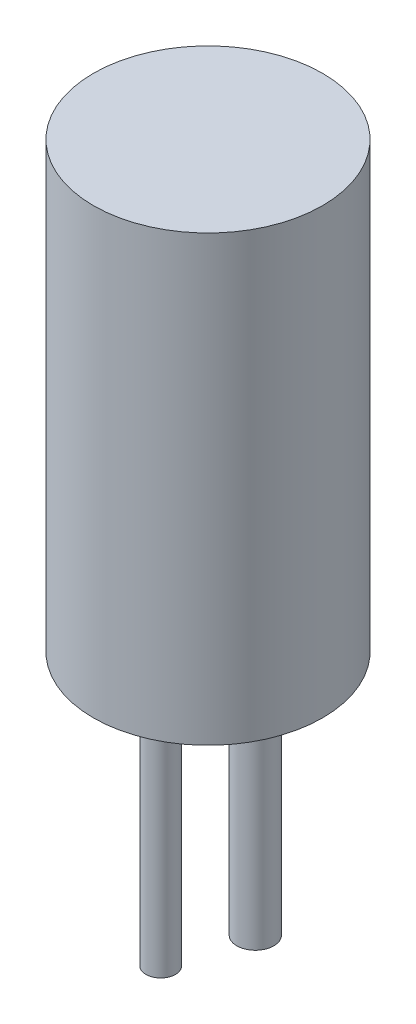
ISO-10303-21;
HEADER;
FILE_DESCRIPTION(('STEP AP214'),'2;1');
FILE_NAME('part.step','',(''),(''),'','','');
FILE_SCHEMA(('AUTOMOTIVE_DESIGN { 1 0 10303 214 1 1 1 1 }'));
ENDSEC;
DATA;
#1=APPLICATION_CONTEXT('core data for automotive mechanical design processes');
#2=APPLICATION_PROTOCOL_DEFINITION('international standard','automotive_design',2000,#1);
#3=PRODUCT_CONTEXT('',#1,'mechanical');
#4=PRODUCT('Part','Part','',(#3));
#5=PRODUCT_RELATED_PRODUCT_CATEGORY('part','',(#4));
#6=PRODUCT_DEFINITION_FORMATION('','',#4);
#7=PRODUCT_DEFINITION_CONTEXT('part definition',#1,'design');
#8=PRODUCT_DEFINITION('design','',#6,#7);
#9=PRODUCT_DEFINITION_SHAPE('','',#8);
#10=(LENGTH_UNIT() NAMED_UNIT(*) SI_UNIT(.MILLI.,.METRE.));
#11=(NAMED_UNIT(*) PLANE_ANGLE_UNIT() SI_UNIT($,.RADIAN.));
#12=(NAMED_UNIT(*) SI_UNIT($,.STERADIAN.) SOLID_ANGLE_UNIT());
#13=UNCERTAINTY_MEASURE_WITH_UNIT(LENGTH_MEASURE(1.E-05),#10,'distance_accuracy_value','');
#14=(GEOMETRIC_REPRESENTATION_CONTEXT(3) GLOBAL_UNCERTAINTY_ASSIGNED_CONTEXT((#13)) GLOBAL_UNIT_ASSIGNED_CONTEXT((#10,
#11,#12)) REPRESENTATION_CONTEXT('',''));
#15=CARTESIAN_POINT('',(0.,0.,0.));
#16=DIRECTION('',(0.,0.,1.));
#17=DIRECTION('',(1.,0.,0.));
#18=AXIS2_PLACEMENT_3D('',#15,#16,#17);
#19=CARTESIAN_POINT('',(0.,0.,0.));
#20=DIRECTION('',(0.,1.,0.));
#21=DIRECTION('',(0.,0.,1.));
#22=AXIS2_PLACEMENT_3D('',#19,#20,#21);
#23=PLANE('',#22);
#24=CARTESIAN_POINT('',(-1.28,0.,0.));
#25=DIRECTION('',(0.,1.,0.));
#26=DIRECTION('',(0.,0.,1.));
#27=AXIS2_PLACEMENT_3D('',#24,#25,#26);
#28=CIRCLE('',#27,0.4);
#29=CARTESIAN_POINT('',(-1.28,0.,0.4));
#30=VERTEX_POINT('',#29);
#31=EDGE_CURVE('E38',#30,#30,#28,.F.);
#32=ORIENTED_EDGE('',*,*,#31,.F.);
#33=EDGE_LOOP('',(#32));
#34=FACE_BOUND('',#33,.T.);
#35=CARTESIAN_POINT('',(0.,0.,0.));
#36=DIRECTION('',(0.,1.,0.));
#37=DIRECTION('',(0.,0.,1.));
#38=AXIS2_PLACEMENT_3D('',#35,#36,#37);
#39=CIRCLE('',#38,3.1);
#40=CARTESIAN_POINT('',(0.,0.,3.1));
#41=VERTEX_POINT('',#40);
#42=EDGE_CURVE('E46',#41,#41,#39,.T.);
#43=ORIENTED_EDGE('',*,*,#42,.F.);
#44=EDGE_LOOP('',(#43));
#45=FACE_BOUND('',#44,.T.);
#46=CARTESIAN_POINT('',(1.28,0.,0.));
#47=DIRECTION('',(0.,1.,0.));
#48=DIRECTION('',(0.,0.,1.));
#49=AXIS2_PLACEMENT_3D('',#46,#47,#48);
#50=CIRCLE('',#49,0.500000000000001);
#51=CARTESIAN_POINT('',(1.28,0.,0.5));
#52=VERTEX_POINT('',#51);
#53=EDGE_CURVE('E10',#52,#52,#50,.F.);
#54=ORIENTED_EDGE('',*,*,#53,.F.);
#55=EDGE_LOOP('',(#54));
#56=FACE_BOUND('',#55,.T.);
#57=ADVANCED_FACE('F31',(#34,#45,#56),#23,.F.);
#58=CARTESIAN_POINT('',(0.,12.,0.));
#59=DIRECTION('',(0.,-1.,0.));
#60=DIRECTION('',(0.,0.,-1.));
#61=AXIS2_PLACEMENT_3D('',#58,#59,#60);
#62=CYLINDRICAL_SURFACE('',#61,3.1);
#63=CARTESIAN_POINT('',(0.,12.,0.));
#64=DIRECTION('',(0.,1.,0.));
#65=DIRECTION('',(0.,0.,1.));
#66=AXIS2_PLACEMENT_3D('',#63,#64,#65);
#67=CIRCLE('',#66,3.1);
#68=CARTESIAN_POINT('',(0.,12.,3.1));
#69=VERTEX_POINT('',#68);
#70=EDGE_CURVE('E42',#69,#69,#67,.T.);
#71=ORIENTED_EDGE('',*,*,#70,.F.);
#72=EDGE_LOOP('',(#71));
#73=FACE_BOUND('',#72,.T.);
#74=ORIENTED_EDGE('',*,*,#42,.T.);
#75=EDGE_LOOP('',(#74));
#76=FACE_BOUND('',#75,.T.);
#77=ADVANCED_FACE('F33',(#73,#76),#62,.T.);
#78=CARTESIAN_POINT('',(0.,12.,0.));
#79=DIRECTION('',(0.,1.,0.));
#80=DIRECTION('',(0.,0.,1.));
#81=AXIS2_PLACEMENT_3D('',#78,#79,#80);
#82=PLANE('',#81);
#83=ORIENTED_EDGE('',*,*,#70,.T.);
#84=EDGE_LOOP('',(#83));
#85=FACE_BOUND('',#84,.T.);
#86=ADVANCED_FACE('F77',(#85),#82,.T.);
#87=CARTESIAN_POINT('',(-1.28,-8.,0.));
#88=DIRECTION('',(0.,1.,0.));
#89=DIRECTION('',(0.,0.,1.));
#90=AXIS2_PLACEMENT_3D('',#87,#88,#89);
#91=CYLINDRICAL_SURFACE('',#90,0.4);
#92=CARTESIAN_POINT('',(-1.28,-8.,0.));
#93=DIRECTION('',(0.,-1.,0.));
#94=DIRECTION('',(0.,0.,-1.));
#95=AXIS2_PLACEMENT_3D('',#92,#93,#94);
#96=CIRCLE('',#95,0.4);
#97=CARTESIAN_POINT('',(-1.28,-8.,-0.4));
#98=VERTEX_POINT('',#97);
#99=EDGE_CURVE('E50',#98,#98,#96,.T.);
#100=ORIENTED_EDGE('',*,*,#99,.F.);
#101=EDGE_LOOP('',(#100));
#102=FACE_BOUND('',#101,.T.);
#103=ORIENTED_EDGE('',*,*,#31,.T.);
#104=EDGE_LOOP('',(#103));
#105=FACE_BOUND('',#104,.T.);
#106=ADVANCED_FACE('F69',(#102,#105),#91,.T.);
#107=CARTESIAN_POINT('',(-1.28,-8.,0.));
#108=DIRECTION('',(0.,-1.,0.));
#109=DIRECTION('',(0.,0.,-1.));
#110=AXIS2_PLACEMENT_3D('',#107,#108,#109);
#111=PLANE('',#110);
#112=ORIENTED_EDGE('',*,*,#99,.T.);
#113=EDGE_LOOP('',(#112));
#114=FACE_BOUND('',#113,.T.);
#115=ADVANCED_FACE('F62',(#114),#111,.T.);
#116=CARTESIAN_POINT('',(1.28,-6.,0.));
#117=DIRECTION('',(0.,1.,0.));
#118=DIRECTION('',(0.,0.,1.));
#119=AXIS2_PLACEMENT_3D('',#116,#117,#118);
#120=CYLINDRICAL_SURFACE('',#119,0.500000000000001);
#121=CARTESIAN_POINT('',(1.28,-6.,0.));
#122=DIRECTION('',(0.,-1.,0.));
#123=DIRECTION('',(0.,0.,-1.));
#124=AXIS2_PLACEMENT_3D('',#121,#122,#123);
#125=CIRCLE('',#124,0.500000000000001);
#126=CARTESIAN_POINT('',(1.28,-6.,-0.500000000000001));
#127=VERTEX_POINT('',#126);
#128=EDGE_CURVE('E54',#127,#127,#125,.T.);
#129=ORIENTED_EDGE('',*,*,#128,.F.);
#130=EDGE_LOOP('',(#129));
#131=FACE_BOUND('',#130,.T.);
#132=ORIENTED_EDGE('',*,*,#53,.T.);
#133=EDGE_LOOP('',(#132));
#134=FACE_BOUND('',#133,.T.);
#135=ADVANCED_FACE('F60',(#131,#134),#120,.T.);
#136=CARTESIAN_POINT('',(1.28,-6.,0.));
#137=DIRECTION('',(0.,-1.,0.));
#138=DIRECTION('',(0.,0.,-1.));
#139=AXIS2_PLACEMENT_3D('',#136,#137,#138);
#140=PLANE('',#139);
#141=ORIENTED_EDGE('',*,*,#128,.T.);
#142=EDGE_LOOP('',(#141));
#143=FACE_BOUND('',#142,.T.);
#144=ADVANCED_FACE('F58',(#143),#140,.T.);
#145=CLOSED_SHELL('',(#57,#77,#86,#106,#115,#135,#144));
#146=MANIFOLD_SOLID_BREP('B2',#145);
#147=ADVANCED_BREP_SHAPE_REPRESENTATION('',(#18,#146),#14);
#148=SHAPE_DEFINITION_REPRESENTATION(#9,#147);
ENDSEC;
END-ISO-10303-21;
